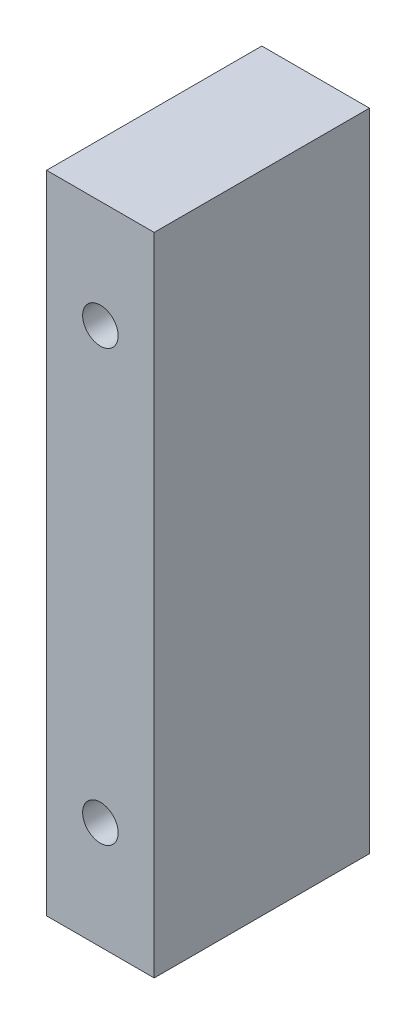
ISO-10303-21;
HEADER;
FILE_DESCRIPTION(('STEP AP214'),'2;1');
FILE_NAME('part.step','',(''),(''),'','','');
FILE_SCHEMA(('AUTOMOTIVE_DESIGN { 1 0 10303 214 1 1 1 1 }'));
ENDSEC;
DATA;
#1=APPLICATION_CONTEXT('core data for automotive mechanical design processes');
#2=APPLICATION_PROTOCOL_DEFINITION('international standard','automotive_design',2000,#1);
#3=PRODUCT_CONTEXT('',#1,'mechanical');
#4=PRODUCT('Part','Part','',(#3));
#5=PRODUCT_RELATED_PRODUCT_CATEGORY('part','',(#4));
#6=PRODUCT_DEFINITION_FORMATION('','',#4);
#7=PRODUCT_DEFINITION_CONTEXT('part definition',#1,'design');
#8=PRODUCT_DEFINITION('design','',#6,#7);
#9=PRODUCT_DEFINITION_SHAPE('','',#8);
#10=(LENGTH_UNIT() NAMED_UNIT(*) SI_UNIT(.MILLI.,.METRE.));
#11=(NAMED_UNIT(*) PLANE_ANGLE_UNIT() SI_UNIT($,.RADIAN.));
#12=(NAMED_UNIT(*) SI_UNIT($,.STERADIAN.) SOLID_ANGLE_UNIT());
#13=UNCERTAINTY_MEASURE_WITH_UNIT(LENGTH_MEASURE(1.E-05),#10,'distance_accuracy_value','');
#14=(GEOMETRIC_REPRESENTATION_CONTEXT(3) GLOBAL_UNCERTAINTY_ASSIGNED_CONTEXT((#13)) GLOBAL_UNIT_ASSIGNED_CONTEXT((#10,
#11,#12)) REPRESENTATION_CONTEXT('',''));
#15=CARTESIAN_POINT('',(0.,0.,0.));
#16=DIRECTION('',(0.,0.,1.));
#17=DIRECTION('',(1.,0.,0.));
#18=AXIS2_PLACEMENT_3D('',#15,#16,#17);
#19=CARTESIAN_POINT('',(0.,0.,40.));
#20=DIRECTION('',(0.,0.,-1.));
#21=DIRECTION('',(-1.,0.,0.));
#22=AXIS2_PLACEMENT_3D('',#19,#20,#21);
#23=PLANE('',#22);
#24=DIRECTION('',(0.,-1.,0.));
#25=VECTOR('',#24,1.);
#26=CARTESIAN_POINT('',(0.,0.,40.));
#27=LINE('',#26,#25);
#28=CARTESIAN_POINT('',(0.,120.,40.));
#29=VERTEX_POINT('',#28);
#30=CARTESIAN_POINT('',(0.,0.,40.));
#31=VERTEX_POINT('',#30);
#32=EDGE_CURVE('E98',#29,#31,#27,.T.);
#33=ORIENTED_EDGE('',*,*,#32,.T.);
#34=DIRECTION('',(1.,0.,0.));
#35=VECTOR('',#34,1.);
#36=CARTESIAN_POINT('',(0.,0.,40.));
#37=LINE('',#36,#35);
#38=CARTESIAN_POINT('',(20.,0.,40.));
#39=VERTEX_POINT('',#38);
#40=EDGE_CURVE('E93',#31,#39,#37,.T.);
#41=ORIENTED_EDGE('',*,*,#40,.T.);
#42=DIRECTION('',(0.,1.,0.));
#43=VECTOR('',#42,1.);
#44=CARTESIAN_POINT('',(20.,0.,40.));
#45=LINE('',#44,#43);
#46=CARTESIAN_POINT('',(20.,120.,40.));
#47=VERTEX_POINT('',#46);
#48=EDGE_CURVE('E96',#39,#47,#45,.T.);
#49=ORIENTED_EDGE('',*,*,#48,.T.);
#50=DIRECTION('',(-1.,0.,0.));
#51=VECTOR('',#50,1.);
#52=CARTESIAN_POINT('',(0.,120.,40.));
#53=LINE('',#52,#51);
#54=EDGE_CURVE('E63',#47,#29,#53,.T.);
#55=ORIENTED_EDGE('',*,*,#54,.T.);
#56=EDGE_LOOP('',(#33,#41,#49,#55));
#57=FACE_BOUND('',#56,.T.);
#58=CARTESIAN_POINT('',(10.,20.,40.));
#59=DIRECTION('',(0.,0.,1.));
#60=DIRECTION('',(1.,0.,0.));
#61=AXIS2_PLACEMENT_3D('',#58,#59,#60);
#62=CIRCLE('',#61,3.3);
#63=CARTESIAN_POINT('',(13.3,20.,40.));
#64=VERTEX_POINT('',#63);
#65=EDGE_CURVE('E119',#64,#64,#62,.T.);
#66=ORIENTED_EDGE('',*,*,#65,.F.);
#67=EDGE_LOOP('',(#66));
#68=FACE_BOUND('',#67,.T.);
#69=CARTESIAN_POINT('',(10.,100.,40.));
#70=DIRECTION('',(0.,0.,1.));
#71=DIRECTION('',(1.,0.,0.));
#72=AXIS2_PLACEMENT_3D('',#69,#70,#71);
#73=CIRCLE('',#72,3.3);
#74=CARTESIAN_POINT('',(13.3,100.,40.));
#75=VERTEX_POINT('',#74);
#76=EDGE_CURVE('E141',#75,#75,#73,.T.);
#77=ORIENTED_EDGE('',*,*,#76,.F.);
#78=EDGE_LOOP('',(#77));
#79=FACE_BOUND('',#78,.T.);
#80=ADVANCED_FACE('F45',(#57,#68,#79),#23,.F.);
#81=CARTESIAN_POINT('',(0.,0.,0.));
#82=DIRECTION('',(0.,0.,-1.));
#83=DIRECTION('',(-1.,0.,0.));
#84=AXIS2_PLACEMENT_3D('',#81,#82,#83);
#85=PLANE('',#84);
#86=CARTESIAN_POINT('',(10.,20.,0.));
#87=DIRECTION('',(0.,0.,1.));
#88=DIRECTION('',(1.,0.,0.));
#89=AXIS2_PLACEMENT_3D('',#86,#87,#88);
#90=CIRCLE('',#89,3.3);
#91=CARTESIAN_POINT('',(13.3,20.,0.));
#92=VERTEX_POINT('',#91);
#93=EDGE_CURVE('E137',#92,#92,#90,.T.);
#94=ORIENTED_EDGE('',*,*,#93,.T.);
#95=EDGE_LOOP('',(#94));
#96=FACE_BOUND('',#95,.T.);
#97=DIRECTION('',(0.,-1.,0.));
#98=VECTOR('',#97,1.);
#99=CARTESIAN_POINT('',(0.,0.,0.));
#100=LINE('',#99,#98);
#101=CARTESIAN_POINT('',(0.,120.,0.));
#102=VERTEX_POINT('',#101);
#103=CARTESIAN_POINT('',(0.,0.,0.));
#104=VERTEX_POINT('',#103);
#105=EDGE_CURVE('E115',#102,#104,#100,.T.);
#106=ORIENTED_EDGE('',*,*,#105,.F.);
#107=DIRECTION('',(-1.,0.,0.));
#108=VECTOR('',#107,1.);
#109=CARTESIAN_POINT('',(0.,120.,0.));
#110=LINE('',#109,#108);
#111=CARTESIAN_POINT('',(20.,120.,0.));
#112=VERTEX_POINT('',#111);
#113=EDGE_CURVE('E86',#112,#102,#110,.T.);
#114=ORIENTED_EDGE('',*,*,#113,.F.);
#115=DIRECTION('',(0.,1.,0.));
#116=VECTOR('',#115,1.);
#117=CARTESIAN_POINT('',(20.,0.,0.));
#118=LINE('',#117,#116);
#119=CARTESIAN_POINT('',(20.,0.,0.));
#120=VERTEX_POINT('',#119);
#121=EDGE_CURVE('E80',#120,#112,#118,.T.);
#122=ORIENTED_EDGE('',*,*,#121,.F.);
#123=DIRECTION('',(1.,0.,0.));
#124=VECTOR('',#123,1.);
#125=CARTESIAN_POINT('',(0.,0.,0.));
#126=LINE('',#125,#124);
#127=EDGE_CURVE('E103',#104,#120,#126,.T.);
#128=ORIENTED_EDGE('',*,*,#127,.F.);
#129=EDGE_LOOP('',(#106,#114,#122,#128));
#130=FACE_BOUND('',#129,.T.);
#131=CARTESIAN_POINT('',(10.,100.,0.));
#132=DIRECTION('',(0.,0.,1.));
#133=DIRECTION('',(1.,0.,0.));
#134=AXIS2_PLACEMENT_3D('',#131,#132,#133);
#135=CIRCLE('',#134,3.3);
#136=CARTESIAN_POINT('',(13.3,100.,0.));
#137=VERTEX_POINT('',#136);
#138=EDGE_CURVE('E144',#137,#137,#135,.T.);
#139=ORIENTED_EDGE('',*,*,#138,.T.);
#140=EDGE_LOOP('',(#139));
#141=FACE_BOUND('',#140,.T.);
#142=ADVANCED_FACE('F132',(#96,#130,#141),#85,.T.);
#143=CARTESIAN_POINT('',(0.,0.,40.));
#144=DIRECTION('',(1.,0.,0.));
#145=DIRECTION('',(0.,0.,-1.));
#146=AXIS2_PLACEMENT_3D('',#143,#144,#145);
#147=PLANE('',#146);
#148=ORIENTED_EDGE('',*,*,#105,.T.);
#149=DIRECTION('',(0.,0.,-1.));
#150=VECTOR('',#149,1.);
#151=CARTESIAN_POINT('',(0.,0.,40.));
#152=LINE('',#151,#150);
#153=EDGE_CURVE('E11',#31,#104,#152,.T.);
#154=ORIENTED_EDGE('',*,*,#153,.F.);
#155=ORIENTED_EDGE('',*,*,#32,.F.);
#156=DIRECTION('',(0.,0.,-1.));
#157=VECTOR('',#156,1.);
#158=CARTESIAN_POINT('',(0.,120.,40.));
#159=LINE('',#158,#157);
#160=EDGE_CURVE('E111',#29,#102,#159,.T.);
#161=ORIENTED_EDGE('',*,*,#160,.T.);
#162=EDGE_LOOP('',(#148,#154,#155,#161));
#163=FACE_BOUND('',#162,.T.);
#164=ADVANCED_FACE('F47',(#163),#147,.F.);
#165=CARTESIAN_POINT('',(0.,0.,40.));
#166=DIRECTION('',(0.,1.,0.));
#167=DIRECTION('',(0.,0.,1.));
#168=AXIS2_PLACEMENT_3D('',#165,#166,#167);
#169=PLANE('',#168);
#170=ORIENTED_EDGE('',*,*,#127,.T.);
#171=DIRECTION('',(0.,0.,-1.));
#172=VECTOR('',#171,1.);
#173=CARTESIAN_POINT('',(20.,0.,40.));
#174=LINE('',#173,#172);
#175=EDGE_CURVE('E55',#39,#120,#174,.T.);
#176=ORIENTED_EDGE('',*,*,#175,.F.);
#177=ORIENTED_EDGE('',*,*,#40,.F.);
#178=ORIENTED_EDGE('',*,*,#153,.T.);
#179=EDGE_LOOP('',(#170,#176,#177,#178));
#180=FACE_BOUND('',#179,.T.);
#181=ADVANCED_FACE('F102',(#180),#169,.F.);
#182=CARTESIAN_POINT('',(20.,0.,40.));
#183=DIRECTION('',(-1.,0.,0.));
#184=DIRECTION('',(0.,0.,1.));
#185=AXIS2_PLACEMENT_3D('',#182,#183,#184);
#186=PLANE('',#185);
#187=ORIENTED_EDGE('',*,*,#121,.T.);
#188=DIRECTION('',(0.,0.,-1.));
#189=VECTOR('',#188,1.);
#190=CARTESIAN_POINT('',(20.,120.,40.));
#191=LINE('',#190,#189);
#192=EDGE_CURVE('E105',#47,#112,#191,.T.);
#193=ORIENTED_EDGE('',*,*,#192,.F.);
#194=ORIENTED_EDGE('',*,*,#48,.F.);
#195=ORIENTED_EDGE('',*,*,#175,.T.);
#196=EDGE_LOOP('',(#187,#193,#194,#195));
#197=FACE_BOUND('',#196,.T.);
#198=ADVANCED_FACE('F106',(#197),#186,.F.);
#199=CARTESIAN_POINT('',(0.,120.,40.));
#200=DIRECTION('',(0.,-1.,0.));
#201=DIRECTION('',(0.,0.,-1.));
#202=AXIS2_PLACEMENT_3D('',#199,#200,#201);
#203=PLANE('',#202);
#204=ORIENTED_EDGE('',*,*,#113,.T.);
#205=ORIENTED_EDGE('',*,*,#160,.F.);
#206=ORIENTED_EDGE('',*,*,#54,.F.);
#207=ORIENTED_EDGE('',*,*,#192,.T.);
#208=EDGE_LOOP('',(#204,#205,#206,#207));
#209=FACE_BOUND('',#208,.T.);
#210=ADVANCED_FACE('F129',(#209),#203,.F.);
#211=CARTESIAN_POINT('',(10.,20.,40.));
#212=DIRECTION('',(0.,0.,-1.));
#213=DIRECTION('',(-1.,0.,0.));
#214=AXIS2_PLACEMENT_3D('',#211,#212,#213);
#215=CYLINDRICAL_SURFACE('',#214,3.3);
#216=ORIENTED_EDGE('',*,*,#65,.T.);
#217=EDGE_LOOP('',(#216));
#218=FACE_BOUND('',#217,.T.);
#219=ORIENTED_EDGE('',*,*,#93,.F.);
#220=EDGE_LOOP('',(#219));
#221=FACE_BOUND('',#220,.T.);
#222=ADVANCED_FACE('F162',(#218,#221),#215,.F.);
#223=CARTESIAN_POINT('',(10.,100.,40.));
#224=DIRECTION('',(0.,0.,-1.));
#225=DIRECTION('',(-1.,0.,0.));
#226=AXIS2_PLACEMENT_3D('',#223,#224,#225);
#227=CYLINDRICAL_SURFACE('',#226,3.3);
#228=ORIENTED_EDGE('',*,*,#76,.T.);
#229=EDGE_LOOP('',(#228));
#230=FACE_BOUND('',#229,.T.);
#231=ORIENTED_EDGE('',*,*,#138,.F.);
#232=EDGE_LOOP('',(#231));
#233=FACE_BOUND('',#232,.T.);
#234=ADVANCED_FACE('F152',(#230,#233),#227,.F.);
#235=CLOSED_SHELL('',(#80,#142,#164,#181,#198,#210,#222,#234));
#236=MANIFOLD_SOLID_BREP('B2',#235);
#237=ADVANCED_BREP_SHAPE_REPRESENTATION('',(#18,#236),#14);
#238=SHAPE_DEFINITION_REPRESENTATION(#9,#237);
ENDSEC;
END-ISO-10303-21;
